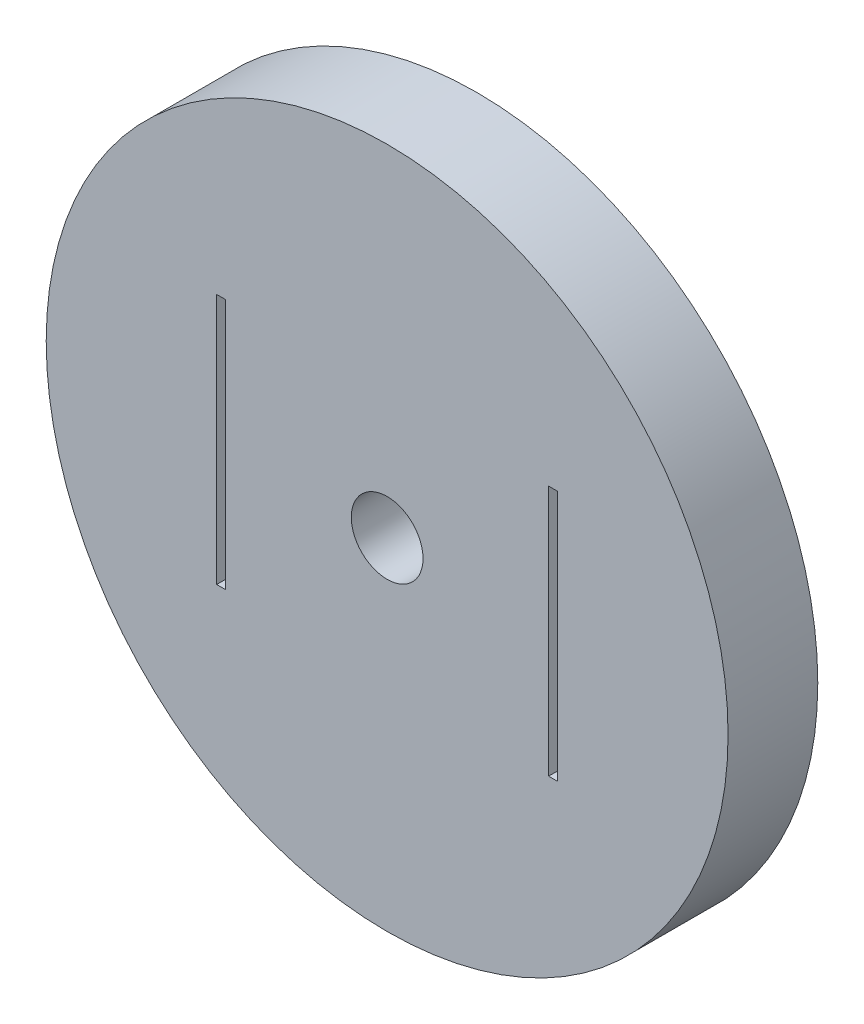
ISO-10303-21;
HEADER;
FILE_DESCRIPTION(('STEP AP214'),'2;1');
FILE_NAME('part.step','',(''),(''),'','','');
FILE_SCHEMA(('AUTOMOTIVE_DESIGN { 1 0 10303 214 1 1 1 1 }'));
ENDSEC;
DATA;
#1=APPLICATION_CONTEXT('core data for automotive mechanical design processes');
#2=APPLICATION_PROTOCOL_DEFINITION('international standard','automotive_design',2000,#1);
#3=PRODUCT_CONTEXT('',#1,'mechanical');
#4=PRODUCT('Part','Part','',(#3));
#5=PRODUCT_RELATED_PRODUCT_CATEGORY('part','',(#4));
#6=PRODUCT_DEFINITION_FORMATION('','',#4);
#7=PRODUCT_DEFINITION_CONTEXT('part definition',#1,'design');
#8=PRODUCT_DEFINITION('design','',#6,#7);
#9=PRODUCT_DEFINITION_SHAPE('','',#8);
#10=(LENGTH_UNIT() NAMED_UNIT(*) SI_UNIT(.MILLI.,.METRE.));
#11=(NAMED_UNIT(*) PLANE_ANGLE_UNIT() SI_UNIT($,.RADIAN.));
#12=(NAMED_UNIT(*) SI_UNIT($,.STERADIAN.) SOLID_ANGLE_UNIT());
#13=UNCERTAINTY_MEASURE_WITH_UNIT(LENGTH_MEASURE(1.E-05),#10,'distance_accuracy_value','');
#14=(GEOMETRIC_REPRESENTATION_CONTEXT(3) GLOBAL_UNCERTAINTY_ASSIGNED_CONTEXT((#13)) GLOBAL_UNIT_ASSIGNED_CONTEXT((#10,
#11,#12)) REPRESENTATION_CONTEXT('',''));
#15=CARTESIAN_POINT('',(0.,0.,0.));
#16=DIRECTION('',(0.,0.,1.));
#17=DIRECTION('',(1.,0.,0.));
#18=AXIS2_PLACEMENT_3D('',#15,#16,#17);
#19=CARTESIAN_POINT('',(0.,0.,5.));
#20=DIRECTION('',(0.,0.,1.));
#21=DIRECTION('',(1.,0.,0.));
#22=AXIS2_PLACEMENT_3D('',#19,#20,#21);
#23=PLANE('',#22);
#24=CARTESIAN_POINT('',(0.,0.,5.));
#25=DIRECTION('',(0.,0.,1.));
#26=DIRECTION('',(1.,0.,0.));
#27=AXIS2_PLACEMENT_3D('',#24,#25,#26);
#28=CIRCLE('',#27,19.);
#29=CARTESIAN_POINT('',(19.,0.,5.));
#30=VERTEX_POINT('',#29);
#31=EDGE_CURVE('E42',#30,#30,#28,.T.);
#32=ORIENTED_EDGE('',*,*,#31,.T.);
#33=EDGE_LOOP('',(#32));
#34=FACE_BOUND('',#33,.T.);
#35=CARTESIAN_POINT('',(0.,0.,5.));
#36=DIRECTION('',(0.,0.,1.));
#37=DIRECTION('',(1.,0.,0.));
#38=AXIS2_PLACEMENT_3D('',#35,#36,#37);
#39=CIRCLE('',#38,2.);
#40=CARTESIAN_POINT('',(2.,0.,5.));
#41=VERTEX_POINT('',#40);
#42=EDGE_CURVE('E168',#41,#41,#39,.T.);
#43=ORIENTED_EDGE('',*,*,#42,.F.);
#44=EDGE_LOOP('',(#43));
#45=FACE_BOUND('',#44,.T.);
#46=DIRECTION('',(1.,0.,0.));
#47=VECTOR('',#46,1.);
#48=CARTESIAN_POINT('',(-9.5,-7.,5.));
#49=LINE('',#48,#47);
#50=CARTESIAN_POINT('',(-9.5,-7.,5.));
#51=VERTEX_POINT('',#50);
#52=CARTESIAN_POINT('',(-9.,-7.,5.));
#53=VERTEX_POINT('',#52);
#54=EDGE_CURVE('E139',#51,#53,#49,.T.);
#55=ORIENTED_EDGE('',*,*,#54,.F.);
#56=DIRECTION('',(0.,-1.,0.));
#57=VECTOR('',#56,1.);
#58=CARTESIAN_POINT('',(-9.5,7.,5.));
#59=LINE('',#58,#57);
#60=CARTESIAN_POINT('',(-9.5,7.,5.));
#61=VERTEX_POINT('',#60);
#62=EDGE_CURVE('E137',#61,#51,#59,.T.);
#63=ORIENTED_EDGE('',*,*,#62,.F.);
#64=DIRECTION('',(-1.,0.,0.));
#65=VECTOR('',#64,1.);
#66=CARTESIAN_POINT('',(-9.5,7.,5.));
#67=LINE('',#66,#65);
#68=CARTESIAN_POINT('',(-9.,7.,5.));
#69=VERTEX_POINT('',#68);
#70=EDGE_CURVE('E145',#69,#61,#67,.T.);
#71=ORIENTED_EDGE('',*,*,#70,.F.);
#72=DIRECTION('',(0.,1.,0.));
#73=VECTOR('',#72,1.);
#74=CARTESIAN_POINT('',(-9.,7.,5.));
#75=LINE('',#74,#73);
#76=EDGE_CURVE('E142',#53,#69,#75,.T.);
#77=ORIENTED_EDGE('',*,*,#76,.F.);
#78=EDGE_LOOP('',(#55,#63,#71,#77));
#79=FACE_BOUND('',#78,.T.);
#80=DIRECTION('',(0.,-1.,0.));
#81=VECTOR('',#80,1.);
#82=CARTESIAN_POINT('',(9.,7.,5.));
#83=LINE('',#82,#81);
#84=CARTESIAN_POINT('',(9.,7.,5.));
#85=VERTEX_POINT('',#84);
#86=CARTESIAN_POINT('',(9.,-7.,5.));
#87=VERTEX_POINT('',#86);
#88=EDGE_CURVE('E108',#85,#87,#83,.T.);
#89=ORIENTED_EDGE('',*,*,#88,.F.);
#90=DIRECTION('',(-1.,0.,0.));
#91=VECTOR('',#90,1.);
#92=CARTESIAN_POINT('',(9.5,7.,5.));
#93=LINE('',#92,#91);
#94=CARTESIAN_POINT('',(9.5,7.,5.));
#95=VERTEX_POINT('',#94);
#96=EDGE_CURVE('E100',#95,#85,#93,.T.);
#97=ORIENTED_EDGE('',*,*,#96,.F.);
#98=DIRECTION('',(0.,1.,0.));
#99=VECTOR('',#98,1.);
#100=CARTESIAN_POINT('',(9.5,7.,5.));
#101=LINE('',#100,#99);
#102=CARTESIAN_POINT('',(9.5,-7.,5.));
#103=VERTEX_POINT('',#102);
#104=EDGE_CURVE('E122',#103,#95,#101,.T.);
#105=ORIENTED_EDGE('',*,*,#104,.F.);
#106=DIRECTION('',(1.,0.,0.));
#107=VECTOR('',#106,1.);
#108=CARTESIAN_POINT('',(9.5,-7.,5.));
#109=LINE('',#108,#107);
#110=EDGE_CURVE('E120',#87,#103,#109,.T.);
#111=ORIENTED_EDGE('',*,*,#110,.F.);
#112=EDGE_LOOP('',(#89,#97,#105,#111));
#113=FACE_BOUND('',#112,.T.);
#114=ADVANCED_FACE('F33',(#34,#45,#79,#113),#23,.T.);
#115=CARTESIAN_POINT('',(0.,0.,0.));
#116=DIRECTION('',(0.,0.,1.));
#117=DIRECTION('',(1.,0.,0.));
#118=AXIS2_PLACEMENT_3D('',#115,#116,#117);
#119=PLANE('',#118);
#120=CARTESIAN_POINT('',(-14.5,0.,0.));
#121=DIRECTION('',(0.,0.,-1.));
#122=DIRECTION('',(-1.,0.,0.));
#123=AXIS2_PLACEMENT_3D('',#120,#121,#122);
#124=CIRCLE('',#123,2.5);
#125=CARTESIAN_POINT('',(-17.,0.,0.));
#126=VERTEX_POINT('',#125);
#127=EDGE_CURVE('E11',#126,#126,#124,.T.);
#128=ORIENTED_EDGE('',*,*,#127,.F.);
#129=EDGE_LOOP('',(#128));
#130=FACE_BOUND('',#129,.T.);
#131=DIRECTION('',(0.,-1.,0.));
#132=VECTOR('',#131,1.);
#133=CARTESIAN_POINT('',(-9.5,7.,0.));
#134=LINE('',#133,#132);
#135=CARTESIAN_POINT('',(-9.5,7.,0.));
#136=VERTEX_POINT('',#135);
#137=CARTESIAN_POINT('',(-9.5,-7.,0.));
#138=VERTEX_POINT('',#137);
#139=EDGE_CURVE('E116',#136,#138,#134,.T.);
#140=ORIENTED_EDGE('',*,*,#139,.T.);
#141=DIRECTION('',(1.,0.,0.));
#142=VECTOR('',#141,1.);
#143=CARTESIAN_POINT('',(-9.5,-7.,0.));
#144=LINE('',#143,#142);
#145=CARTESIAN_POINT('',(-9.,-7.,0.));
#146=VERTEX_POINT('',#145);
#147=EDGE_CURVE('E150',#138,#146,#144,.T.);
#148=ORIENTED_EDGE('',*,*,#147,.T.);
#149=DIRECTION('',(0.,1.,0.));
#150=VECTOR('',#149,1.);
#151=CARTESIAN_POINT('',(-9.,7.,0.));
#152=LINE('',#151,#150);
#153=CARTESIAN_POINT('',(-9.,7.,0.));
#154=VERTEX_POINT('',#153);
#155=EDGE_CURVE('E153',#146,#154,#152,.T.);
#156=ORIENTED_EDGE('',*,*,#155,.T.);
#157=DIRECTION('',(-1.,0.,0.));
#158=VECTOR('',#157,1.);
#159=CARTESIAN_POINT('',(-9.5,7.,0.));
#160=LINE('',#159,#158);
#161=EDGE_CURVE('E140',#154,#136,#160,.T.);
#162=ORIENTED_EDGE('',*,*,#161,.T.);
#163=EDGE_LOOP('',(#140,#148,#156,#162));
#164=FACE_BOUND('',#163,.T.);
#165=CARTESIAN_POINT('',(0.,0.,0.));
#166=DIRECTION('',(0.,0.,1.));
#167=DIRECTION('',(1.,0.,0.));
#168=AXIS2_PLACEMENT_3D('',#165,#166,#167);
#169=CIRCLE('',#168,19.);
#170=CARTESIAN_POINT('',(19.,0.,0.));
#171=VERTEX_POINT('',#170);
#172=EDGE_CURVE('E37',#171,#171,#169,.T.);
#173=ORIENTED_EDGE('',*,*,#172,.F.);
#174=EDGE_LOOP('',(#173));
#175=FACE_BOUND('',#174,.T.);
#176=CARTESIAN_POINT('',(0.,0.,0.));
#177=DIRECTION('',(0.,0.,1.));
#178=DIRECTION('',(1.,0.,0.));
#179=AXIS2_PLACEMENT_3D('',#176,#177,#178);
#180=CIRCLE('',#179,2.);
#181=CARTESIAN_POINT('',(2.,0.,0.));
#182=VERTEX_POINT('',#181);
#183=EDGE_CURVE('E167',#182,#182,#180,.T.);
#184=ORIENTED_EDGE('',*,*,#183,.T.);
#185=EDGE_LOOP('',(#184));
#186=FACE_BOUND('',#185,.T.);
#187=DIRECTION('',(-1.,0.,0.));
#188=VECTOR('',#187,1.);
#189=CARTESIAN_POINT('',(9.5,7.,0.));
#190=LINE('',#189,#188);
#191=CARTESIAN_POINT('',(9.5,7.,0.));
#192=VERTEX_POINT('',#191);
#193=CARTESIAN_POINT('',(9.,7.,0.));
#194=VERTEX_POINT('',#193);
#195=EDGE_CURVE('E58',#192,#194,#190,.T.);
#196=ORIENTED_EDGE('',*,*,#195,.T.);
#197=DIRECTION('',(0.,-1.,0.));
#198=VECTOR('',#197,1.);
#199=CARTESIAN_POINT('',(9.,7.,0.));
#200=LINE('',#199,#198);
#201=CARTESIAN_POINT('',(9.,-7.,0.));
#202=VERTEX_POINT('',#201);
#203=EDGE_CURVE('E115',#194,#202,#200,.T.);
#204=ORIENTED_EDGE('',*,*,#203,.T.);
#205=DIRECTION('',(1.,0.,0.));
#206=VECTOR('',#205,1.);
#207=CARTESIAN_POINT('',(9.5,-7.,0.));
#208=LINE('',#207,#206);
#209=CARTESIAN_POINT('',(9.5,-7.,0.));
#210=VERTEX_POINT('',#209);
#211=EDGE_CURVE('E129',#202,#210,#208,.T.);
#212=ORIENTED_EDGE('',*,*,#211,.T.);
#213=DIRECTION('',(0.,1.,0.));
#214=VECTOR('',#213,1.);
#215=CARTESIAN_POINT('',(9.5,7.,0.));
#216=LINE('',#215,#214);
#217=EDGE_CURVE('E109',#210,#192,#216,.T.);
#218=ORIENTED_EDGE('',*,*,#217,.T.);
#219=EDGE_LOOP('',(#196,#204,#212,#218));
#220=FACE_BOUND('',#219,.T.);
#221=ADVANCED_FACE('F179',(#130,#164,#175,#186,#220),#119,.F.);
#222=CARTESIAN_POINT('',(0.,0.,5.));
#223=DIRECTION('',(0.,0.,-1.));
#224=DIRECTION('',(-1.,0.,0.));
#225=AXIS2_PLACEMENT_3D('',#222,#223,#224);
#226=CYLINDRICAL_SURFACE('',#225,19.);
#227=ORIENTED_EDGE('',*,*,#31,.F.);
#228=EDGE_LOOP('',(#227));
#229=FACE_BOUND('',#228,.T.);
#230=ORIENTED_EDGE('',*,*,#172,.T.);
#231=EDGE_LOOP('',(#230));
#232=FACE_BOUND('',#231,.T.);
#233=ADVANCED_FACE('F35',(#229,#232),#226,.T.);
#234=CARTESIAN_POINT('',(0.,0.,5.));
#235=DIRECTION('',(0.,0.,-1.));
#236=DIRECTION('',(-1.,0.,0.));
#237=AXIS2_PLACEMENT_3D('',#234,#235,#236);
#238=CYLINDRICAL_SURFACE('',#237,2.);
#239=ORIENTED_EDGE('',*,*,#42,.T.);
#240=EDGE_LOOP('',(#239));
#241=FACE_BOUND('',#240,.T.);
#242=ORIENTED_EDGE('',*,*,#183,.F.);
#243=EDGE_LOOP('',(#242));
#244=FACE_BOUND('',#243,.T.);
#245=ADVANCED_FACE('F206',(#241,#244),#238,.F.);
#246=CARTESIAN_POINT('',(-9.5,7.,5.));
#247=DIRECTION('',(1.,0.,0.));
#248=DIRECTION('',(0.,1.,0.));
#249=AXIS2_PLACEMENT_3D('',#246,#247,#248);
#250=PLANE('',#249);
#251=ORIENTED_EDGE('',*,*,#139,.F.);
#252=DIRECTION('',(0.,0.,-1.));
#253=VECTOR('',#252,1.);
#254=CARTESIAN_POINT('',(-9.5,7.,5.));
#255=LINE('',#254,#253);
#256=EDGE_CURVE('E147',#61,#136,#255,.T.);
#257=ORIENTED_EDGE('',*,*,#256,.F.);
#258=ORIENTED_EDGE('',*,*,#62,.T.);
#259=DIRECTION('',(0.,0.,-1.));
#260=VECTOR('',#259,1.);
#261=CARTESIAN_POINT('',(-9.5,-7.,5.));
#262=LINE('',#261,#260);
#263=EDGE_CURVE('E164',#51,#138,#262,.T.);
#264=ORIENTED_EDGE('',*,*,#263,.T.);
#265=EDGE_LOOP('',(#251,#257,#258,#264));
#266=FACE_BOUND('',#265,.T.);
#267=ADVANCED_FACE('F209',(#266),#250,.T.);
#268=CARTESIAN_POINT('',(-9.5,-7.,5.));
#269=DIRECTION('',(0.,1.,0.));
#270=DIRECTION('',(-1.,0.,0.));
#271=AXIS2_PLACEMENT_3D('',#268,#269,#270);
#272=PLANE('',#271);
#273=ORIENTED_EDGE('',*,*,#147,.F.);
#274=ORIENTED_EDGE('',*,*,#263,.F.);
#275=ORIENTED_EDGE('',*,*,#54,.T.);
#276=DIRECTION('',(0.,0.,-1.));
#277=VECTOR('',#276,1.);
#278=CARTESIAN_POINT('',(-9.,-7.,5.));
#279=LINE('',#278,#277);
#280=EDGE_CURVE('E162',#53,#146,#279,.T.);
#281=ORIENTED_EDGE('',*,*,#280,.T.);
#282=EDGE_LOOP('',(#273,#274,#275,#281));
#283=FACE_BOUND('',#282,.T.);
#284=ADVANCED_FACE('F213',(#283),#272,.T.);
#285=CARTESIAN_POINT('',(-9.,7.,5.));
#286=DIRECTION('',(-1.,0.,0.));
#287=DIRECTION('',(0.,-1.,0.));
#288=AXIS2_PLACEMENT_3D('',#285,#286,#287);
#289=PLANE('',#288);
#290=ORIENTED_EDGE('',*,*,#155,.F.);
#291=ORIENTED_EDGE('',*,*,#280,.F.);
#292=ORIENTED_EDGE('',*,*,#76,.T.);
#293=DIRECTION('',(0.,0.,-1.));
#294=VECTOR('',#293,1.);
#295=CARTESIAN_POINT('',(-9.,7.,5.));
#296=LINE('',#295,#294);
#297=EDGE_CURVE('E160',#69,#154,#296,.T.);
#298=ORIENTED_EDGE('',*,*,#297,.T.);
#299=EDGE_LOOP('',(#290,#291,#292,#298));
#300=FACE_BOUND('',#299,.T.);
#301=ADVANCED_FACE('F217',(#300),#289,.T.);
#302=CARTESIAN_POINT('',(-9.5,7.,5.));
#303=DIRECTION('',(0.,-1.,0.));
#304=DIRECTION('',(0.,0.,-1.));
#305=AXIS2_PLACEMENT_3D('',#302,#303,#304);
#306=PLANE('',#305);
#307=ORIENTED_EDGE('',*,*,#161,.F.);
#308=ORIENTED_EDGE('',*,*,#297,.F.);
#309=ORIENTED_EDGE('',*,*,#70,.T.);
#310=ORIENTED_EDGE('',*,*,#256,.T.);
#311=EDGE_LOOP('',(#307,#308,#309,#310));
#312=FACE_BOUND('',#311,.T.);
#313=ADVANCED_FACE('F221',(#312),#306,.T.);
#314=CARTESIAN_POINT('',(9.5,7.,5.));
#315=DIRECTION('',(0.,-1.,0.));
#316=DIRECTION('',(0.,0.,-1.));
#317=AXIS2_PLACEMENT_3D('',#314,#315,#316);
#318=PLANE('',#317);
#319=ORIENTED_EDGE('',*,*,#195,.F.);
#320=DIRECTION('',(0.,0.,-1.));
#321=VECTOR('',#320,1.);
#322=CARTESIAN_POINT('',(9.5,7.,5.));
#323=LINE('',#322,#321);
#324=EDGE_CURVE('E104',#95,#192,#323,.T.);
#325=ORIENTED_EDGE('',*,*,#324,.F.);
#326=ORIENTED_EDGE('',*,*,#96,.T.);
#327=DIRECTION('',(0.,0.,-1.));
#328=VECTOR('',#327,1.);
#329=CARTESIAN_POINT('',(9.,7.,5.));
#330=LINE('',#329,#328);
#331=EDGE_CURVE('E103',#85,#194,#330,.T.);
#332=ORIENTED_EDGE('',*,*,#331,.T.);
#333=EDGE_LOOP('',(#319,#325,#326,#332));
#334=FACE_BOUND('',#333,.T.);
#335=ADVANCED_FACE('F102',(#334),#318,.T.);
#336=CARTESIAN_POINT('',(9.,7.,5.));
#337=DIRECTION('',(1.,0.,0.));
#338=DIRECTION('',(0.,1.,0.));
#339=AXIS2_PLACEMENT_3D('',#336,#337,#338);
#340=PLANE('',#339);
#341=ORIENTED_EDGE('',*,*,#203,.F.);
#342=ORIENTED_EDGE('',*,*,#331,.F.);
#343=ORIENTED_EDGE('',*,*,#88,.T.);
#344=DIRECTION('',(0.,0.,-1.));
#345=VECTOR('',#344,1.);
#346=CARTESIAN_POINT('',(9.,-7.,5.));
#347=LINE('',#346,#345);
#348=EDGE_CURVE('E117',#87,#202,#347,.T.);
#349=ORIENTED_EDGE('',*,*,#348,.T.);
#350=EDGE_LOOP('',(#341,#342,#343,#349));
#351=FACE_BOUND('',#350,.T.);
#352=ADVANCED_FACE('F112',(#351),#340,.T.);
#353=CARTESIAN_POINT('',(9.5,-7.,5.));
#354=DIRECTION('',(0.,1.,0.));
#355=DIRECTION('',(-1.,0.,0.));
#356=AXIS2_PLACEMENT_3D('',#353,#354,#355);
#357=PLANE('',#356);
#358=ORIENTED_EDGE('',*,*,#211,.F.);
#359=ORIENTED_EDGE('',*,*,#348,.F.);
#360=ORIENTED_EDGE('',*,*,#110,.T.);
#361=DIRECTION('',(0.,0.,-1.));
#362=VECTOR('',#361,1.);
#363=CARTESIAN_POINT('',(9.5,-7.,5.));
#364=LINE('',#363,#362);
#365=EDGE_CURVE('E50',#103,#210,#364,.T.);
#366=ORIENTED_EDGE('',*,*,#365,.T.);
#367=EDGE_LOOP('',(#358,#359,#360,#366));
#368=FACE_BOUND('',#367,.T.);
#369=ADVANCED_FACE('F189',(#368),#357,.T.);
#370=CARTESIAN_POINT('',(9.5,7.,5.));
#371=DIRECTION('',(-1.,0.,0.));
#372=DIRECTION('',(0.,-1.,0.));
#373=AXIS2_PLACEMENT_3D('',#370,#371,#372);
#374=PLANE('',#373);
#375=ORIENTED_EDGE('',*,*,#217,.F.);
#376=ORIENTED_EDGE('',*,*,#365,.F.);
#377=ORIENTED_EDGE('',*,*,#104,.T.);
#378=ORIENTED_EDGE('',*,*,#324,.T.);
#379=EDGE_LOOP('',(#375,#376,#377,#378));
#380=FACE_BOUND('',#379,.T.);
#381=ADVANCED_FACE('F186',(#380),#374,.T.);
#382=CARTESIAN_POINT('',(-14.5,0.,-6.));
#383=DIRECTION('',(0.,0.,-1.));
#384=DIRECTION('',(-1.,0.,0.));
#385=AXIS2_PLACEMENT_3D('',#382,#383,#384);
#386=CYLINDRICAL_SURFACE('',#385,2.5);
#387=ORIENTED_EDGE('',*,*,#127,.T.);
#388=EDGE_LOOP('',(#387));
#389=FACE_BOUND('',#388,.T.);
#390=CARTESIAN_POINT('',(-14.5,0.,-6.));
#391=DIRECTION('',(0.,0.,-1.));
#392=DIRECTION('',(-1.,0.,0.));
#393=AXIS2_PLACEMENT_3D('',#390,#391,#392);
#394=CIRCLE('',#393,2.5);
#395=CARTESIAN_POINT('',(-17.,0.,-6.));
#396=VERTEX_POINT('',#395);
#397=EDGE_CURVE('E127',#396,#396,#394,.T.);
#398=ORIENTED_EDGE('',*,*,#397,.F.);
#399=EDGE_LOOP('',(#398));
#400=FACE_BOUND('',#399,.T.);
#401=ADVANCED_FACE('F188',(#389,#400),#386,.T.);
#402=CARTESIAN_POINT('',(-14.5,0.,-6.));
#403=DIRECTION('',(0.,0.,-1.));
#404=DIRECTION('',(-1.,0.,0.));
#405=AXIS2_PLACEMENT_3D('',#402,#403,#404);
#406=SPHERICAL_SURFACE('',#405,2.5);
#407=ORIENTED_EDGE('',*,*,#397,.T.);
#408=EDGE_LOOP('',(#407));
#409=FACE_BOUND('',#408,.T.);
#410=ADVANCED_FACE('F195',(#409),#406,.T.);
#411=CLOSED_SHELL('',(#114,#221,#233,#245,#267,#284,#301,#313,#335,#352,#369,#381,#401,#410));
#412=MANIFOLD_SOLID_BREP('B2',#411);
#413=ADVANCED_BREP_SHAPE_REPRESENTATION('',(#18,#412),#14);
#414=SHAPE_DEFINITION_REPRESENTATION(#9,#413);
ENDSEC;
END-ISO-10303-21;
